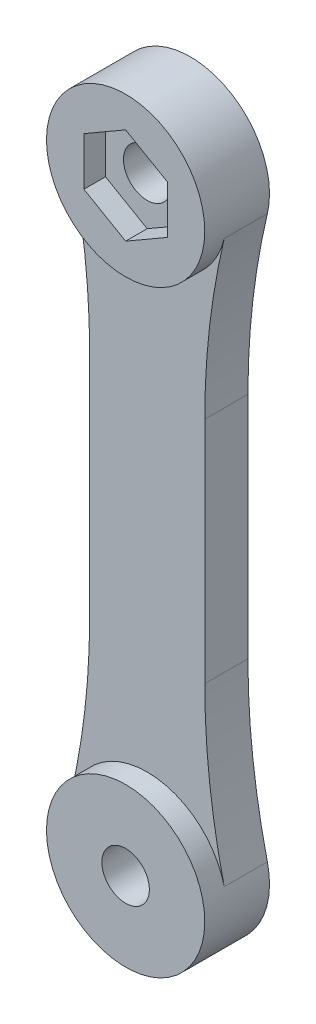
ISO-10303-21;
HEADER;
FILE_DESCRIPTION(('STEP AP214'),'2;1');
FILE_NAME('part.step','',(''),(''),'','','');
FILE_SCHEMA(('AUTOMOTIVE_DESIGN { 1 0 10303 214 1 1 1 1 }'));
ENDSEC;
DATA;
#1=APPLICATION_CONTEXT('core data for automotive mechanical design processes');
#2=APPLICATION_PROTOCOL_DEFINITION('international standard','automotive_design',2000,#1);
#3=PRODUCT_CONTEXT('',#1,'mechanical');
#4=PRODUCT('Part','Part','',(#3));
#5=PRODUCT_RELATED_PRODUCT_CATEGORY('part','',(#4));
#6=PRODUCT_DEFINITION_FORMATION('','',#4);
#7=PRODUCT_DEFINITION_CONTEXT('part definition',#1,'design');
#8=PRODUCT_DEFINITION('design','',#6,#7);
#9=PRODUCT_DEFINITION_SHAPE('','',#8);
#10=(LENGTH_UNIT() NAMED_UNIT(*) SI_UNIT(.MILLI.,.METRE.));
#11=(NAMED_UNIT(*) PLANE_ANGLE_UNIT() SI_UNIT($,.RADIAN.));
#12=(NAMED_UNIT(*) SI_UNIT($,.STERADIAN.) SOLID_ANGLE_UNIT());
#13=UNCERTAINTY_MEASURE_WITH_UNIT(LENGTH_MEASURE(1.E-05),#10,'distance_accuracy_value','');
#14=(GEOMETRIC_REPRESENTATION_CONTEXT(3) GLOBAL_UNCERTAINTY_ASSIGNED_CONTEXT((#13)) GLOBAL_UNIT_ASSIGNED_CONTEXT((#10,
#11,#12)) REPRESENTATION_CONTEXT('',''));
#15=CARTESIAN_POINT('',(0.,0.,0.));
#16=DIRECTION('',(0.,0.,1.));
#17=DIRECTION('',(1.,0.,0.));
#18=AXIS2_PLACEMENT_3D('',#15,#16,#17);
#19=CARTESIAN_POINT('',(1.82960326738668,-20.4654075970708,3.));
#20=DIRECTION('',(0.,0.,-1.));
#21=DIRECTION('',(-1.,0.,0.));
#22=AXIS2_PLACEMENT_3D('',#19,#20,#21);
#23=PLANE('',#22);
#24=CARTESIAN_POINT('',(1.82960326738667,21.0844268382,3.));
#25=DIRECTION('',(0.,0.,1.));
#26=DIRECTION('',(1.,0.,0.));
#27=AXIS2_PLACEMENT_3D('',#24,#25,#26);
#28=CIRCLE('',#27,5.5);
#29=CARTESIAN_POINT('',(-3.52174808396468,19.8143722274095,3.));
#30=VERTEX_POINT('',#29);
#31=CARTESIAN_POINT('',(7.18095461873802,19.8143722274095,3.));
#32=VERTEX_POINT('',#31);
#33=EDGE_CURVE('E57',#30,#32,#28,.T.);
#34=ORIENTED_EDGE('',*,*,#33,.F.);
#35=CARTESIAN_POINT('',(-52.1703967326133,8.26842122022369,3.));
#36=DIRECTION('',(0.,0.,-1.));
#37=DIRECTION('',(-1.,0.,0.));
#38=AXIS2_PLACEMENT_3D('',#35,#36,#37);
#39=CIRCLE('',#38,50.);
#40=CARTESIAN_POINT('',(-2.17039673261332,8.26842122022369,3.));
#41=VERTEX_POINT('',#40);
#42=EDGE_CURVE('E337',#30,#41,#39,.T.);
#43=ORIENTED_EDGE('',*,*,#42,.T.);
#44=DIRECTION('',(0.,-1.,0.));
#45=VECTOR('',#44,1.);
#46=CARTESIAN_POINT('',(-2.17039673261332,17.3095096205646,3.));
#47=LINE('',#46,#45);
#48=CARTESIAN_POINT('',(-2.17039673261332,-7.64940197909452,3.));
#49=VERTEX_POINT('',#48);
#50=EDGE_CURVE('E291',#41,#49,#47,.T.);
#51=ORIENTED_EDGE('',*,*,#50,.T.);
#52=CARTESIAN_POINT('',(-52.1703967326133,-7.64940197909452,3.));
#53=DIRECTION('',(0.,0.,-1.));
#54=DIRECTION('',(-1.,0.,0.));
#55=AXIS2_PLACEMENT_3D('',#52,#53,#54);
#56=CIRCLE('',#55,50.);
#57=CARTESIAN_POINT('',(-3.52174808396466,-19.1953529862804,3.));
#58=VERTEX_POINT('',#57);
#59=EDGE_CURVE('E328',#49,#58,#56,.T.);
#60=ORIENTED_EDGE('',*,*,#59,.T.);
#61=CARTESIAN_POINT('',(1.82960326738669,-20.4654075970708,3.));
#62=DIRECTION('',(0.,0.,1.));
#63=DIRECTION('',(1.,0.,0.));
#64=AXIS2_PLACEMENT_3D('',#61,#62,#63);
#65=CIRCLE('',#64,5.49999999999999);
#66=CARTESIAN_POINT('',(7.18095461873803,-19.1953529862803,3.));
#67=VERTEX_POINT('',#66);
#68=EDGE_CURVE('E276',#67,#58,#65,.T.);
#69=ORIENTED_EDGE('',*,*,#68,.F.);
#70=CARTESIAN_POINT('',(55.8296032673867,-7.64940197909448,3.));
#71=DIRECTION('',(0.,0.,-1.));
#72=DIRECTION('',(-1.,0.,0.));
#73=AXIS2_PLACEMENT_3D('',#70,#71,#72);
#74=CIRCLE('',#73,50.);
#75=CARTESIAN_POINT('',(5.82960326738668,-7.64940197909448,3.));
#76=VERTEX_POINT('',#75);
#77=EDGE_CURVE('E333',#67,#76,#74,.T.);
#78=ORIENTED_EDGE('',*,*,#77,.T.);
#79=DIRECTION('',(0.,1.,0.));
#80=VECTOR('',#79,1.);
#81=CARTESIAN_POINT('',(5.82960326738668,17.3095096205646,3.));
#82=LINE('',#81,#80);
#83=CARTESIAN_POINT('',(5.82960326738668,8.26842122022365,3.));
#84=VERTEX_POINT('',#83);
#85=EDGE_CURVE('E288',#76,#84,#82,.T.);
#86=ORIENTED_EDGE('',*,*,#85,.T.);
#87=CARTESIAN_POINT('',(55.8296032673867,8.26842122022365,3.));
#88=DIRECTION('',(0.,0.,-1.));
#89=DIRECTION('',(-1.,0.,0.));
#90=AXIS2_PLACEMENT_3D('',#87,#88,#89);
#91=CIRCLE('',#90,50.);
#92=EDGE_CURVE('E11',#84,#32,#91,.T.);
#93=ORIENTED_EDGE('',*,*,#92,.T.);
#94=EDGE_LOOP('',(#34,#43,#51,#60,#69,#78,#86,#93));
#95=FACE_BOUND('',#94,.T.);
#96=ADVANCED_FACE('F34',(#95),#23,.F.);
#97=DIRECTION('',(-0.86602540378444,0.499999999999997,0.));
#98=VECTOR('',#97,1.);
#99=CARTESIAN_POINT('',(1.82960326738667,24.4330583994998,3.));
#100=LINE('',#99,#98);
#101=CARTESIAN_POINT('',(4.72960326738667,22.7587426188499,3.));
#102=VERTEX_POINT('',#101);
#103=CARTESIAN_POINT('',(1.82960326738667,24.4330583994998,3.));
#104=VERTEX_POINT('',#103);
#105=EDGE_CURVE('E228',#102,#104,#100,.T.);
#106=ORIENTED_EDGE('',*,*,#105,.T.);
#107=DIRECTION('',(-0.866025403784437,-0.500000000000004,0.));
#108=VECTOR('',#107,1.);
#109=CARTESIAN_POINT('',(-1.07039673261333,22.7587426188499,3.));
#110=LINE('',#109,#108);
#111=CARTESIAN_POINT('',(-1.07039673261333,22.7587426188499,3.));
#112=VERTEX_POINT('',#111);
#113=EDGE_CURVE('E240',#104,#112,#110,.T.);
#114=ORIENTED_EDGE('',*,*,#113,.T.);
#115=DIRECTION('',(0.,-1.,0.));
#116=VECTOR('',#115,1.);
#117=CARTESIAN_POINT('',(-1.07039673261333,22.7587426188499,3.));
#118=LINE('',#117,#116);
#119=CARTESIAN_POINT('',(-1.07039673261333,19.41011105755,3.));
#120=VERTEX_POINT('',#119);
#121=EDGE_CURVE('E243',#112,#120,#118,.T.);
#122=ORIENTED_EDGE('',*,*,#121,.T.);
#123=DIRECTION('',(0.86602540378444,-0.499999999999997,0.));
#124=VECTOR('',#123,1.);
#125=CARTESIAN_POINT('',(-1.07039673261333,19.41011105755,3.));
#126=LINE('',#125,#124);
#127=CARTESIAN_POINT('',(1.82960326738668,17.7357952769001,3.));
#128=VERTEX_POINT('',#127);
#129=EDGE_CURVE('E246',#120,#128,#126,.T.);
#130=ORIENTED_EDGE('',*,*,#129,.T.);
#131=DIRECTION('',(0.866025403784437,0.500000000000003,0.));
#132=VECTOR('',#131,1.);
#133=CARTESIAN_POINT('',(1.82960326738668,17.7357952769001,3.));
#134=LINE('',#133,#132);
#135=CARTESIAN_POINT('',(4.72960326738667,19.4101110575501,3.));
#136=VERTEX_POINT('',#135);
#137=EDGE_CURVE('E249',#128,#136,#134,.T.);
#138=ORIENTED_EDGE('',*,*,#137,.T.);
#139=DIRECTION('',(0.,1.,0.));
#140=VECTOR('',#139,1.);
#141=CARTESIAN_POINT('',(4.72960326738667,22.7587426188499,3.));
#142=LINE('',#141,#140);
#143=EDGE_CURVE('E252',#136,#102,#142,.T.);
#144=ORIENTED_EDGE('',*,*,#143,.T.);
#145=EDGE_LOOP('',(#106,#114,#122,#130,#138,#144));
#146=FACE_BOUND('',#145,.T.);
#147=CARTESIAN_POINT('',(1.82960326738668,21.0844268382,3.));
#148=DIRECTION('',(0.,0.,1.));
#149=DIRECTION('',(1.,0.,0.));
#150=AXIS2_PLACEMENT_3D('',#147,#148,#149);
#151=CIRCLE('',#150,1.65);
#152=CARTESIAN_POINT('',(3.47960326738668,21.0844268382,3.));
#153=VERTEX_POINT('',#152);
#154=EDGE_CURVE('E282',#153,#153,#151,.T.);
#155=ORIENTED_EDGE('',*,*,#154,.F.);
#156=EDGE_LOOP('',(#155));
#157=FACE_BOUND('',#156,.T.);
#158=ADVANCED_FACE('F401',(#146,#157),#23,.F.);
#159=CARTESIAN_POINT('',(1.82960326738668,-20.4654075970708,0.));
#160=DIRECTION('',(0.,0.,-1.));
#161=DIRECTION('',(-1.,0.,0.));
#162=AXIS2_PLACEMENT_3D('',#159,#160,#161);
#163=PLANE('',#162);
#164=DIRECTION('',(0.866025403784436,-0.500000000000005,0.));
#165=VECTOR('',#164,1.);
#166=CARTESIAN_POINT('',(4.72960326738668,-18.7910918164209,0.));
#167=LINE('',#166,#165);
#168=CARTESIAN_POINT('',(1.82960326738669,-17.116776035771,0.));
#169=VERTEX_POINT('',#168);
#170=CARTESIAN_POINT('',(4.72960326738668,-18.7910918164209,0.));
#171=VERTEX_POINT('',#170);
#172=EDGE_CURVE('E50',#169,#171,#167,.T.);
#173=ORIENTED_EDGE('',*,*,#172,.F.);
#174=DIRECTION('',(0.866025403784442,0.499999999999995,0.));
#175=VECTOR('',#174,1.);
#176=CARTESIAN_POINT('',(1.82960326738669,-17.116776035771,0.));
#177=LINE('',#176,#175);
#178=CARTESIAN_POINT('',(-1.07039673261332,-18.7910918164209,0.));
#179=VERTEX_POINT('',#178);
#180=EDGE_CURVE('E192',#179,#169,#177,.T.);
#181=ORIENTED_EDGE('',*,*,#180,.F.);
#182=DIRECTION('',(0.,1.,0.));
#183=VECTOR('',#182,1.);
#184=CARTESIAN_POINT('',(-1.07039673261332,-18.7910918164209,0.));
#185=LINE('',#184,#183);
#186=CARTESIAN_POINT('',(-1.07039673261332,-22.1397233777207,0.));
#187=VERTEX_POINT('',#186);
#188=EDGE_CURVE('E195',#187,#179,#185,.T.);
#189=ORIENTED_EDGE('',*,*,#188,.F.);
#190=DIRECTION('',(-0.866025403784436,0.500000000000005,0.));
#191=VECTOR('',#190,1.);
#192=CARTESIAN_POINT('',(1.82960326738667,-23.8140391583706,0.));
#193=LINE('',#192,#191);
#194=CARTESIAN_POINT('',(1.82960326738667,-23.8140391583706,0.));
#195=VERTEX_POINT('',#194);
#196=EDGE_CURVE('E211',#195,#187,#193,.T.);
#197=ORIENTED_EDGE('',*,*,#196,.F.);
#198=DIRECTION('',(-0.866025403784441,-0.499999999999996,0.));
#199=VECTOR('',#198,1.);
#200=CARTESIAN_POINT('',(4.72960326738668,-22.1397233777207,0.));
#201=LINE('',#200,#199);
#202=CARTESIAN_POINT('',(4.72960326738668,-22.1397233777207,0.));
#203=VERTEX_POINT('',#202);
#204=EDGE_CURVE('E208',#203,#195,#201,.T.);
#205=ORIENTED_EDGE('',*,*,#204,.F.);
#206=DIRECTION('',(0.,-1.,0.));
#207=VECTOR('',#206,1.);
#208=CARTESIAN_POINT('',(4.72960326738668,-18.7910918164209,0.));
#209=LINE('',#208,#207);
#210=EDGE_CURVE('E206',#171,#203,#209,.T.);
#211=ORIENTED_EDGE('',*,*,#210,.F.);
#212=EDGE_LOOP('',(#173,#181,#189,#197,#205,#211));
#213=FACE_BOUND('',#212,.T.);
#214=CARTESIAN_POINT('',(1.82960326738668,21.0844268382,0.));
#215=DIRECTION('',(0.,0.,1.));
#216=DIRECTION('',(1.,0.,0.));
#217=AXIS2_PLACEMENT_3D('',#214,#215,#216);
#218=CIRCLE('',#217,1.65);
#219=CARTESIAN_POINT('',(3.47960326738668,21.0844268382,0.));
#220=VERTEX_POINT('',#219);
#221=EDGE_CURVE('E280',#220,#220,#218,.T.);
#222=ORIENTED_EDGE('',*,*,#221,.T.);
#223=EDGE_LOOP('',(#222));
#224=FACE_BOUND('',#223,.T.);
#225=CARTESIAN_POINT('',(1.82960326738668,-20.4654075970708,0.));
#226=DIRECTION('',(0.,0.,1.));
#227=DIRECTION('',(-1.,0.,0.));
#228=AXIS2_PLACEMENT_3D('',#225,#226,#227);
#229=CIRCLE('',#228,5.5);
#230=CARTESIAN_POINT('',(-3.52174808396467,-19.1953529862804,0.));
#231=VERTEX_POINT('',#230);
#232=CARTESIAN_POINT('',(7.18095461873803,-19.1953529862803,0.));
#233=VERTEX_POINT('',#232);
#234=EDGE_CURVE('E285',#231,#233,#229,.T.);
#235=ORIENTED_EDGE('',*,*,#234,.F.);
#236=CARTESIAN_POINT('',(-52.1703967326133,-7.64940197909452,0.));
#237=DIRECTION('',(0.,0.,-1.));
#238=DIRECTION('',(-1.,0.,0.));
#239=AXIS2_PLACEMENT_3D('',#236,#237,#238);
#240=CIRCLE('',#239,50.);
#241=CARTESIAN_POINT('',(-2.17039673261332,-7.64940197909452,0.));
#242=VERTEX_POINT('',#241);
#243=EDGE_CURVE('E326',#231,#242,#240,.F.);
#244=ORIENTED_EDGE('',*,*,#243,.T.);
#245=DIRECTION('',(0.,-1.,0.));
#246=VECTOR('',#245,1.);
#247=CARTESIAN_POINT('',(-2.17039673261332,17.3095096205646,0.));
#248=LINE('',#247,#246);
#249=CARTESIAN_POINT('',(-2.17039673261332,8.26842122022369,0.));
#250=VERTEX_POINT('',#249);
#251=EDGE_CURVE('E292',#250,#242,#248,.T.);
#252=ORIENTED_EDGE('',*,*,#251,.F.);
#253=CARTESIAN_POINT('',(-52.1703967326133,8.26842122022369,0.));
#254=DIRECTION('',(0.,0.,-1.));
#255=DIRECTION('',(-1.,0.,0.));
#256=AXIS2_PLACEMENT_3D('',#253,#254,#255);
#257=CIRCLE('',#256,50.);
#258=CARTESIAN_POINT('',(-3.52174808396467,19.8143722274095,0.));
#259=VERTEX_POINT('',#258);
#260=EDGE_CURVE('E335',#250,#259,#257,.F.);
#261=ORIENTED_EDGE('',*,*,#260,.T.);
#262=CARTESIAN_POINT('',(1.82960326738668,21.0844268382,0.));
#263=DIRECTION('',(0.,0.,1.));
#264=DIRECTION('',(1.,0.,0.));
#265=AXIS2_PLACEMENT_3D('',#262,#263,#264);
#266=CIRCLE('',#265,5.5);
#267=CARTESIAN_POINT('',(7.18095461873803,19.8143722274095,0.));
#268=VERTEX_POINT('',#267);
#269=EDGE_CURVE('E301',#268,#259,#266,.T.);
#270=ORIENTED_EDGE('',*,*,#269,.F.);
#271=CARTESIAN_POINT('',(55.8296032673867,8.26842122022365,0.));
#272=DIRECTION('',(0.,0.,-1.));
#273=DIRECTION('',(-1.,0.,0.));
#274=AXIS2_PLACEMENT_3D('',#271,#272,#273);
#275=CIRCLE('',#274,50.);
#276=CARTESIAN_POINT('',(5.82960326738668,8.26842122022365,0.));
#277=VERTEX_POINT('',#276);
#278=EDGE_CURVE('E43',#268,#277,#275,.F.);
#279=ORIENTED_EDGE('',*,*,#278,.T.);
#280=DIRECTION('',(0.,1.,0.));
#281=VECTOR('',#280,1.);
#282=CARTESIAN_POINT('',(5.82960326738668,17.3095096205646,0.));
#283=LINE('',#282,#281);
#284=CARTESIAN_POINT('',(5.82960326738668,-7.64940197909448,0.));
#285=VERTEX_POINT('',#284);
#286=EDGE_CURVE('E298',#285,#277,#283,.T.);
#287=ORIENTED_EDGE('',*,*,#286,.F.);
#288=CARTESIAN_POINT('',(55.8296032673867,-7.64940197909448,0.));
#289=DIRECTION('',(0.,0.,-1.));
#290=DIRECTION('',(-1.,0.,0.));
#291=AXIS2_PLACEMENT_3D('',#288,#289,#290);
#292=CIRCLE('',#291,50.);
#293=EDGE_CURVE('E331',#285,#233,#292,.F.);
#294=ORIENTED_EDGE('',*,*,#293,.T.);
#295=EDGE_LOOP('',(#235,#244,#252,#261,#270,#279,#287,#294));
#296=FACE_BOUND('',#295,.T.);
#297=ADVANCED_FACE('F343',(#213,#224,#296),#163,.T.);
#298=CARTESIAN_POINT('',(1.82960326738668,-20.4654075970708,3.));
#299=DIRECTION('',(0.,0.,-1.));
#300=DIRECTION('',(-1.,0.,0.));
#301=AXIS2_PLACEMENT_3D('',#298,#299,#300);
#302=CYLINDRICAL_SURFACE('',#301,5.5);
#303=ORIENTED_EDGE('',*,*,#68,.T.);
#304=DIRECTION('',(0.,0.,-1.));
#305=VECTOR('',#304,1.);
#306=CARTESIAN_POINT('',(-3.52174808396467,-19.1953529862804,3.));
#307=LINE('',#306,#305);
#308=EDGE_CURVE('E308',#58,#231,#307,.T.);
#309=ORIENTED_EDGE('',*,*,#308,.T.);
#310=ORIENTED_EDGE('',*,*,#234,.T.);
#311=DIRECTION('',(0.,0.,-1.));
#312=VECTOR('',#311,1.);
#313=CARTESIAN_POINT('',(7.18095461873803,-19.1953529862803,3.));
#314=LINE('',#313,#312);
#315=EDGE_CURVE('E295',#233,#67,#314,.F.);
#316=ORIENTED_EDGE('',*,*,#315,.T.);
#317=EDGE_LOOP('',(#303,#309,#310,#316));
#318=FACE_BOUND('',#317,.T.);
#319=CARTESIAN_POINT('',(1.82960326738669,-20.4654075970708,4.5));
#320=DIRECTION('',(0.,0.,1.));
#321=DIRECTION('',(1.,0.,0.));
#322=AXIS2_PLACEMENT_3D('',#319,#320,#321);
#323=CIRCLE('',#322,5.49999999999999);
#324=CARTESIAN_POINT('',(7.32960326738668,-20.4654075970708,4.5));
#325=VERTEX_POINT('',#324);
#326=EDGE_CURVE('E277',#325,#325,#323,.T.);
#327=ORIENTED_EDGE('',*,*,#326,.F.);
#328=EDGE_LOOP('',(#327));
#329=FACE_BOUND('',#328,.T.);
#330=ADVANCED_FACE('F357',(#318,#329),#302,.T.);
#331=CARTESIAN_POINT('',(5.82960326738668,17.3095096205646,3.));
#332=DIRECTION('',(-1.,0.,0.));
#333=DIRECTION('',(0.,0.,1.));
#334=AXIS2_PLACEMENT_3D('',#331,#332,#333);
#335=PLANE('',#334);
#336=ORIENTED_EDGE('',*,*,#85,.F.);
#337=DIRECTION('',(0.,0.,1.));
#338=VECTOR('',#337,1.);
#339=CARTESIAN_POINT('',(5.82960326738668,-7.64940197909448,0.));
#340=LINE('',#339,#338);
#341=EDGE_CURVE('E318',#76,#285,#340,.F.);
#342=ORIENTED_EDGE('',*,*,#341,.T.);
#343=ORIENTED_EDGE('',*,*,#286,.T.);
#344=DIRECTION('',(0.,0.,1.));
#345=VECTOR('',#344,1.);
#346=CARTESIAN_POINT('',(5.82960326738668,8.26842122022365,3.));
#347=LINE('',#346,#345);
#348=EDGE_CURVE('E316',#277,#84,#347,.T.);
#349=ORIENTED_EDGE('',*,*,#348,.T.);
#350=EDGE_LOOP('',(#336,#342,#343,#349));
#351=FACE_BOUND('',#350,.T.);
#352=ADVANCED_FACE('F349',(#351),#335,.F.);
#353=CARTESIAN_POINT('',(1.82960326738668,21.0844268382,3.));
#354=DIRECTION('',(0.,0.,-1.));
#355=DIRECTION('',(-1.,0.,0.));
#356=AXIS2_PLACEMENT_3D('',#353,#354,#355);
#357=CYLINDRICAL_SURFACE('',#356,5.5);
#358=ORIENTED_EDGE('',*,*,#269,.T.);
#359=DIRECTION('',(0.,0.,-1.));
#360=VECTOR('',#359,1.);
#361=CARTESIAN_POINT('',(-3.52174808396467,19.8143722274095,3.));
#362=LINE('',#361,#360);
#363=EDGE_CURVE('E324',#259,#30,#362,.F.);
#364=ORIENTED_EDGE('',*,*,#363,.T.);
#365=ORIENTED_EDGE('',*,*,#33,.T.);
#366=DIRECTION('',(0.,0.,-1.));
#367=VECTOR('',#366,1.);
#368=CARTESIAN_POINT('',(7.18095461873803,19.8143722274095,3.));
#369=LINE('',#368,#367);
#370=EDGE_CURVE('E321',#32,#268,#369,.T.);
#371=ORIENTED_EDGE('',*,*,#370,.T.);
#372=EDGE_LOOP('',(#358,#364,#365,#371));
#373=FACE_BOUND('',#372,.T.);
#374=CARTESIAN_POINT('',(1.82960326738667,21.0844268382,4.5));
#375=DIRECTION('',(0.,0.,1.));
#376=DIRECTION('',(1.,0.,0.));
#377=AXIS2_PLACEMENT_3D('',#374,#375,#376);
#378=CIRCLE('',#377,5.5);
#379=CARTESIAN_POINT('',(7.32960326738667,21.0844268382,4.5));
#380=VERTEX_POINT('',#379);
#381=EDGE_CURVE('E269',#380,#380,#378,.T.);
#382=ORIENTED_EDGE('',*,*,#381,.F.);
#383=EDGE_LOOP('',(#382));
#384=FACE_BOUND('',#383,.T.);
#385=ADVANCED_FACE('F374',(#373,#384),#357,.T.);
#386=CARTESIAN_POINT('',(-2.17039673261332,17.3095096205646,3.));
#387=DIRECTION('',(1.,0.,0.));
#388=DIRECTION('',(0.,0.,-1.));
#389=AXIS2_PLACEMENT_3D('',#386,#387,#388);
#390=PLANE('',#389);
#391=ORIENTED_EDGE('',*,*,#251,.T.);
#392=DIRECTION('',(0.,0.,1.));
#393=VECTOR('',#392,1.);
#394=CARTESIAN_POINT('',(-2.17039673261332,-7.64940197909452,3.));
#395=LINE('',#394,#393);
#396=EDGE_CURVE('E314',#242,#49,#395,.T.);
#397=ORIENTED_EDGE('',*,*,#396,.T.);
#398=ORIENTED_EDGE('',*,*,#50,.F.);
#399=DIRECTION('',(0.,0.,1.));
#400=VECTOR('',#399,1.);
#401=CARTESIAN_POINT('',(-2.17039673261332,8.26842122022369,0.));
#402=LINE('',#401,#400);
#403=EDGE_CURVE('E311',#41,#250,#402,.F.);
#404=ORIENTED_EDGE('',*,*,#403,.T.);
#405=EDGE_LOOP('',(#391,#397,#398,#404));
#406=FACE_BOUND('',#405,.T.);
#407=ADVANCED_FACE('F366',(#406),#390,.F.);
#408=CARTESIAN_POINT('',(1.82960326738668,21.0844268382,3.));
#409=DIRECTION('',(0.,0.,-1.));
#410=DIRECTION('',(-1.,0.,0.));
#411=AXIS2_PLACEMENT_3D('',#408,#409,#410);
#412=CYLINDRICAL_SURFACE('',#411,1.65);
#413=ORIENTED_EDGE('',*,*,#154,.T.);
#414=EDGE_LOOP('',(#413));
#415=FACE_BOUND('',#414,.T.);
#416=ORIENTED_EDGE('',*,*,#221,.F.);
#417=EDGE_LOOP('',(#416));
#418=FACE_BOUND('',#417,.T.);
#419=ADVANCED_FACE('F431',(#415,#418),#412,.F.);
#420=CARTESIAN_POINT('',(1.82960326738668,-20.4654075970708,3.));
#421=DIRECTION('',(0.,0.,-1.));
#422=DIRECTION('',(-1.,0.,0.));
#423=AXIS2_PLACEMENT_3D('',#420,#421,#422);
#424=CYLINDRICAL_SURFACE('',#423,1.65);
#425=CARTESIAN_POINT('',(1.82960326738668,-20.4654075970708,1.5));
#426=DIRECTION('',(0.,0.,1.));
#427=DIRECTION('',(1.,0.,0.));
#428=AXIS2_PLACEMENT_3D('',#425,#426,#427);
#429=CIRCLE('',#428,1.65);
#430=CARTESIAN_POINT('',(3.47960326738668,-20.4654075970708,1.5));
#431=VERTEX_POINT('',#430);
#432=EDGE_CURVE('E38',#431,#431,#429,.T.);
#433=ORIENTED_EDGE('',*,*,#432,.F.);
#434=EDGE_LOOP('',(#433));
#435=FACE_BOUND('',#434,.T.);
#436=CARTESIAN_POINT('',(1.82960326738669,-20.4654075970708,4.5));
#437=DIRECTION('',(0.,0.,1.));
#438=DIRECTION('',(1.,0.,0.));
#439=AXIS2_PLACEMENT_3D('',#436,#437,#438);
#440=CIRCLE('',#439,1.65);
#441=CARTESIAN_POINT('',(3.47960326738669,-20.4654075970708,4.5));
#442=VERTEX_POINT('',#441);
#443=EDGE_CURVE('E272',#442,#442,#440,.T.);
#444=ORIENTED_EDGE('',*,*,#443,.T.);
#445=EDGE_LOOP('',(#444));
#446=FACE_BOUND('',#445,.T.);
#447=ADVANCED_FACE('F498',(#435,#446),#424,.F.);
#448=CARTESIAN_POINT('',(1.82960326738669,-20.4654075970708,4.5));
#449=DIRECTION('',(0.,0.,1.));
#450=DIRECTION('',(1.,0.,0.));
#451=AXIS2_PLACEMENT_3D('',#448,#449,#450);
#452=PLANE('',#451);
#453=ORIENTED_EDGE('',*,*,#326,.T.);
#454=EDGE_LOOP('',(#453));
#455=FACE_BOUND('',#454,.T.);
#456=ORIENTED_EDGE('',*,*,#443,.F.);
#457=EDGE_LOOP('',(#456));
#458=FACE_BOUND('',#457,.T.);
#459=ADVANCED_FACE('F384',(#455,#458),#452,.T.);
#460=CARTESIAN_POINT('',(1.82960326738667,21.0844268382,4.5));
#461=DIRECTION('',(0.,0.,1.));
#462=DIRECTION('',(1.,0.,0.));
#463=AXIS2_PLACEMENT_3D('',#460,#461,#462);
#464=PLANE('',#463);
#465=ORIENTED_EDGE('',*,*,#381,.T.);
#466=EDGE_LOOP('',(#465));
#467=FACE_BOUND('',#466,.T.);
#468=DIRECTION('',(0.,-1.,0.));
#469=VECTOR('',#468,1.);
#470=CARTESIAN_POINT('',(-1.07039673261333,22.7587426188499,4.5));
#471=LINE('',#470,#469);
#472=CARTESIAN_POINT('',(-1.07039673261333,22.7587426188499,4.5));
#473=VERTEX_POINT('',#472);
#474=CARTESIAN_POINT('',(-1.07039673261333,19.41011105755,4.5));
#475=VERTEX_POINT('',#474);
#476=EDGE_CURVE('E227',#473,#475,#471,.T.);
#477=ORIENTED_EDGE('',*,*,#476,.F.);
#478=DIRECTION('',(-0.866025403784437,-0.500000000000004,0.));
#479=VECTOR('',#478,1.);
#480=CARTESIAN_POINT('',(-1.07039673261333,22.7587426188499,4.5));
#481=LINE('',#480,#479);
#482=CARTESIAN_POINT('',(1.82960326738667,24.4330583994998,4.5));
#483=VERTEX_POINT('',#482);
#484=EDGE_CURVE('E225',#483,#473,#481,.T.);
#485=ORIENTED_EDGE('',*,*,#484,.F.);
#486=DIRECTION('',(-0.86602540378444,0.499999999999997,0.));
#487=VECTOR('',#486,1.);
#488=CARTESIAN_POINT('',(1.82960326738667,24.4330583994998,4.5));
#489=LINE('',#488,#487);
#490=CARTESIAN_POINT('',(4.72960326738667,22.7587426188499,4.5));
#491=VERTEX_POINT('',#490);
#492=EDGE_CURVE('E237',#491,#483,#489,.T.);
#493=ORIENTED_EDGE('',*,*,#492,.F.);
#494=DIRECTION('',(0.,1.,0.));
#495=VECTOR('',#494,1.);
#496=CARTESIAN_POINT('',(4.72960326738667,22.7587426188499,4.5));
#497=LINE('',#496,#495);
#498=CARTESIAN_POINT('',(4.72960326738667,19.4101110575501,4.5));
#499=VERTEX_POINT('',#498);
#500=EDGE_CURVE('E234',#499,#491,#497,.T.);
#501=ORIENTED_EDGE('',*,*,#500,.F.);
#502=DIRECTION('',(0.866025403784437,0.500000000000003,0.));
#503=VECTOR('',#502,1.);
#504=CARTESIAN_POINT('',(1.82960326738668,17.7357952769001,4.5));
#505=LINE('',#504,#503);
#506=CARTESIAN_POINT('',(1.82960326738668,17.7357952769001,4.5));
#507=VERTEX_POINT('',#506);
#508=EDGE_CURVE('E232',#507,#499,#505,.T.);
#509=ORIENTED_EDGE('',*,*,#508,.F.);
#510=DIRECTION('',(0.86602540378444,-0.499999999999997,0.));
#511=VECTOR('',#510,1.);
#512=CARTESIAN_POINT('',(-1.07039673261333,19.41011105755,4.5));
#513=LINE('',#512,#511);
#514=EDGE_CURVE('E230',#475,#507,#513,.T.);
#515=ORIENTED_EDGE('',*,*,#514,.F.);
#516=EDGE_LOOP('',(#477,#485,#493,#501,#509,#515));
#517=FACE_BOUND('',#516,.T.);
#518=ADVANCED_FACE('F380',(#467,#517),#464,.T.);
#519=CARTESIAN_POINT('',(-1.07039673261333,22.7587426188499,4.5));
#520=DIRECTION('',(0.500000000000004,-0.866025403784436,0.));
#521=DIRECTION('',(0.866025403784437,0.500000000000004,0.));
#522=AXIS2_PLACEMENT_3D('',#519,#520,#521);
#523=PLANE('',#522);
#524=ORIENTED_EDGE('',*,*,#113,.F.);
#525=DIRECTION('',(0.,0.,-1.));
#526=VECTOR('',#525,1.);
#527=CARTESIAN_POINT('',(1.82960326738667,24.4330583994998,4.5));
#528=LINE('',#527,#526);
#529=EDGE_CURVE('E239',#483,#104,#528,.T.);
#530=ORIENTED_EDGE('',*,*,#529,.F.);
#531=ORIENTED_EDGE('',*,*,#484,.T.);
#532=DIRECTION('',(0.,0.,-1.));
#533=VECTOR('',#532,1.);
#534=CARTESIAN_POINT('',(-1.07039673261333,22.7587426188499,4.5));
#535=LINE('',#534,#533);
#536=EDGE_CURVE('E266',#473,#112,#535,.T.);
#537=ORIENTED_EDGE('',*,*,#536,.T.);
#538=EDGE_LOOP('',(#524,#530,#531,#537));
#539=FACE_BOUND('',#538,.T.);
#540=ADVANCED_FACE('F383',(#539),#523,.T.);
#541=CARTESIAN_POINT('',(-1.07039673261333,22.7587426188499,4.5));
#542=DIRECTION('',(1.,0.,0.));
#543=DIRECTION('',(0.,1.,0.));
#544=AXIS2_PLACEMENT_3D('',#541,#542,#543);
#545=PLANE('',#544);
#546=ORIENTED_EDGE('',*,*,#121,.F.);
#547=ORIENTED_EDGE('',*,*,#536,.F.);
#548=ORIENTED_EDGE('',*,*,#476,.T.);
#549=DIRECTION('',(0.,0.,-1.));
#550=VECTOR('',#549,1.);
#551=CARTESIAN_POINT('',(-1.07039673261333,19.41011105755,4.5));
#552=LINE('',#551,#550);
#553=EDGE_CURVE('E264',#475,#120,#552,.T.);
#554=ORIENTED_EDGE('',*,*,#553,.T.);
#555=EDGE_LOOP('',(#546,#547,#548,#554));
#556=FACE_BOUND('',#555,.T.);
#557=ADVANCED_FACE('F394',(#556),#545,.T.);
#558=CARTESIAN_POINT('',(-1.07039673261333,19.41011105755,4.5));
#559=DIRECTION('',(0.499999999999997,0.86602540378444,0.));
#560=DIRECTION('',(-0.86602540378444,0.499999999999997,0.));
#561=AXIS2_PLACEMENT_3D('',#558,#559,#560);
#562=PLANE('',#561);
#563=ORIENTED_EDGE('',*,*,#129,.F.);
#564=ORIENTED_EDGE('',*,*,#553,.F.);
#565=ORIENTED_EDGE('',*,*,#514,.T.);
#566=DIRECTION('',(0.,0.,-1.));
#567=VECTOR('',#566,1.);
#568=CARTESIAN_POINT('',(1.82960326738668,17.7357952769001,4.5));
#569=LINE('',#568,#567);
#570=EDGE_CURVE('E262',#507,#128,#569,.T.);
#571=ORIENTED_EDGE('',*,*,#570,.T.);
#572=EDGE_LOOP('',(#563,#564,#565,#571));
#573=FACE_BOUND('',#572,.T.);
#574=ADVANCED_FACE('F397',(#573),#562,.T.);
#575=CARTESIAN_POINT('',(1.82960326738668,17.7357952769001,4.5));
#576=DIRECTION('',(-0.500000000000002,0.866025403784437,0.));
#577=DIRECTION('',(-0.866025403784437,-0.500000000000003,0.));
#578=AXIS2_PLACEMENT_3D('',#575,#576,#577);
#579=PLANE('',#578);
#580=ORIENTED_EDGE('',*,*,#137,.F.);
#581=ORIENTED_EDGE('',*,*,#570,.F.);
#582=ORIENTED_EDGE('',*,*,#508,.T.);
#583=DIRECTION('',(0.,0.,-1.));
#584=VECTOR('',#583,1.);
#585=CARTESIAN_POINT('',(4.72960326738667,19.4101110575501,4.5));
#586=LINE('',#585,#584);
#587=EDGE_CURVE('E260',#499,#136,#586,.T.);
#588=ORIENTED_EDGE('',*,*,#587,.T.);
#589=EDGE_LOOP('',(#580,#581,#582,#588));
#590=FACE_BOUND('',#589,.T.);
#591=ADVANCED_FACE('F415',(#590),#579,.T.);
#592=CARTESIAN_POINT('',(4.72960326738667,22.7587426188499,4.5));
#593=DIRECTION('',(-1.,0.,0.));
#594=DIRECTION('',(0.,-1.,0.));
#595=AXIS2_PLACEMENT_3D('',#592,#593,#594);
#596=PLANE('',#595);
#597=ORIENTED_EDGE('',*,*,#143,.F.);
#598=ORIENTED_EDGE('',*,*,#587,.F.);
#599=ORIENTED_EDGE('',*,*,#500,.T.);
#600=DIRECTION('',(0.,0.,-1.));
#601=VECTOR('',#600,1.);
#602=CARTESIAN_POINT('',(4.72960326738667,22.7587426188499,4.5));
#603=LINE('',#602,#601);
#604=EDGE_CURVE('E258',#491,#102,#603,.T.);
#605=ORIENTED_EDGE('',*,*,#604,.T.);
#606=EDGE_LOOP('',(#597,#598,#599,#605));
#607=FACE_BOUND('',#606,.T.);
#608=ADVANCED_FACE('F413',(#607),#596,.T.);
#609=CARTESIAN_POINT('',(1.82960326738667,24.4330583994998,4.5));
#610=DIRECTION('',(-0.499999999999997,-0.866025403784441,0.));
#611=DIRECTION('',(0.866025403784441,-0.499999999999997,0.));
#612=AXIS2_PLACEMENT_3D('',#609,#610,#611);
#613=PLANE('',#612);
#614=ORIENTED_EDGE('',*,*,#105,.F.);
#615=ORIENTED_EDGE('',*,*,#604,.F.);
#616=ORIENTED_EDGE('',*,*,#492,.T.);
#617=ORIENTED_EDGE('',*,*,#529,.T.);
#618=EDGE_LOOP('',(#614,#615,#616,#617));
#619=FACE_BOUND('',#618,.T.);
#620=ADVANCED_FACE('F408',(#619),#613,.T.);
#621=CARTESIAN_POINT('',(-52.1703967326133,-7.64940197909452,3.));
#622=DIRECTION('',(0.,0.,-1.));
#623=DIRECTION('',(-1.,0.,0.));
#624=AXIS2_PLACEMENT_3D('',#621,#622,#623);
#625=CYLINDRICAL_SURFACE('',#624,50.);
#626=ORIENTED_EDGE('',*,*,#59,.F.);
#627=ORIENTED_EDGE('',*,*,#396,.F.);
#628=ORIENTED_EDGE('',*,*,#243,.F.);
#629=ORIENTED_EDGE('',*,*,#308,.F.);
#630=EDGE_LOOP('',(#626,#627,#628,#629));
#631=FACE_BOUND('',#630,.T.);
#632=ADVANCED_FACE('F362',(#631),#625,.F.);
#633=CARTESIAN_POINT('',(55.8296032673867,-7.64940197909448,3.));
#634=DIRECTION('',(0.,0.,-1.));
#635=DIRECTION('',(-1.,0.,0.));
#636=AXIS2_PLACEMENT_3D('',#633,#634,#635);
#637=CYLINDRICAL_SURFACE('',#636,50.);
#638=ORIENTED_EDGE('',*,*,#77,.F.);
#639=ORIENTED_EDGE('',*,*,#315,.F.);
#640=ORIENTED_EDGE('',*,*,#293,.F.);
#641=ORIENTED_EDGE('',*,*,#341,.F.);
#642=EDGE_LOOP('',(#638,#639,#640,#641));
#643=FACE_BOUND('',#642,.T.);
#644=ADVANCED_FACE('F354',(#643),#637,.F.);
#645=CARTESIAN_POINT('',(-52.1703967326133,8.26842122022369,3.));
#646=DIRECTION('',(0.,0.,-1.));
#647=DIRECTION('',(-1.,0.,0.));
#648=AXIS2_PLACEMENT_3D('',#645,#646,#647);
#649=CYLINDRICAL_SURFACE('',#648,50.);
#650=ORIENTED_EDGE('',*,*,#42,.F.);
#651=ORIENTED_EDGE('',*,*,#363,.F.);
#652=ORIENTED_EDGE('',*,*,#260,.F.);
#653=ORIENTED_EDGE('',*,*,#403,.F.);
#654=EDGE_LOOP('',(#650,#651,#652,#653));
#655=FACE_BOUND('',#654,.T.);
#656=ADVANCED_FACE('F371',(#655),#649,.F.);
#657=CARTESIAN_POINT('',(55.8296032673867,8.26842122022365,3.));
#658=DIRECTION('',(0.,0.,-1.));
#659=DIRECTION('',(-1.,0.,0.));
#660=AXIS2_PLACEMENT_3D('',#657,#658,#659);
#661=CYLINDRICAL_SURFACE('',#660,50.);
#662=ORIENTED_EDGE('',*,*,#92,.F.);
#663=ORIENTED_EDGE('',*,*,#348,.F.);
#664=ORIENTED_EDGE('',*,*,#278,.F.);
#665=ORIENTED_EDGE('',*,*,#370,.F.);
#666=EDGE_LOOP('',(#662,#663,#664,#665));
#667=FACE_BOUND('',#666,.T.);
#668=ADVANCED_FACE('F36',(#667),#661,.F.);
#669=CARTESIAN_POINT('',(4.72960326738668,-18.7910918164209,1.5));
#670=DIRECTION('',(0.500000000000005,0.866025403784436,0.));
#671=DIRECTION('',(-0.866025403784436,0.500000000000005,0.));
#672=AXIS2_PLACEMENT_3D('',#669,#670,#671);
#673=PLANE('',#672);
#674=ORIENTED_EDGE('',*,*,#172,.T.);
#675=DIRECTION('',(0.,0.,-1.));
#676=VECTOR('',#675,1.);
#677=CARTESIAN_POINT('',(4.72960326738668,-18.7910918164209,1.5));
#678=LINE('',#677,#676);
#679=CARTESIAN_POINT('',(4.72960326738668,-18.7910918164209,1.5));
#680=VERTEX_POINT('',#679);
#681=EDGE_CURVE('E169',#680,#171,#678,.T.);
#682=ORIENTED_EDGE('',*,*,#681,.F.);
#683=DIRECTION('',(0.866025403784436,-0.500000000000005,0.));
#684=VECTOR('',#683,1.);
#685=CARTESIAN_POINT('',(4.72960326738668,-18.7910918164209,1.5));
#686=LINE('',#685,#684);
#687=CARTESIAN_POINT('',(1.82960326738669,-17.116776035771,1.5));
#688=VERTEX_POINT('',#687);
#689=EDGE_CURVE('E173',#688,#680,#686,.T.);
#690=ORIENTED_EDGE('',*,*,#689,.F.);
#691=DIRECTION('',(0.,0.,-1.));
#692=VECTOR('',#691,1.);
#693=CARTESIAN_POINT('',(1.82960326738669,-17.116776035771,1.5));
#694=LINE('',#693,#692);
#695=EDGE_CURVE('E216',#688,#169,#694,.T.);
#696=ORIENTED_EDGE('',*,*,#695,.T.);
#697=EDGE_LOOP('',(#674,#682,#690,#696));
#698=FACE_BOUND('',#697,.T.);
#699=ADVANCED_FACE('F171',(#698),#673,.F.);
#700=CARTESIAN_POINT('',(1.82960326738669,-17.116776035771,1.5));
#701=DIRECTION('',(-0.499999999999995,0.866025403784441,0.));
#702=DIRECTION('',(-0.866025403784442,-0.499999999999995,0.));
#703=AXIS2_PLACEMENT_3D('',#700,#701,#702);
#704=PLANE('',#703);
#705=ORIENTED_EDGE('',*,*,#180,.T.);
#706=ORIENTED_EDGE('',*,*,#695,.F.);
#707=DIRECTION('',(0.866025403784442,0.499999999999995,0.));
#708=VECTOR('',#707,1.);
#709=CARTESIAN_POINT('',(1.82960326738669,-17.116776035771,1.5));
#710=LINE('',#709,#708);
#711=CARTESIAN_POINT('',(-1.07039673261332,-18.7910918164209,1.5));
#712=VERTEX_POINT('',#711);
#713=EDGE_CURVE('E179',#712,#688,#710,.T.);
#714=ORIENTED_EDGE('',*,*,#713,.F.);
#715=DIRECTION('',(0.,0.,-1.));
#716=VECTOR('',#715,1.);
#717=CARTESIAN_POINT('',(-1.07039673261332,-18.7910918164209,1.5));
#718=LINE('',#717,#716);
#719=EDGE_CURVE('E218',#712,#179,#718,.T.);
#720=ORIENTED_EDGE('',*,*,#719,.T.);
#721=EDGE_LOOP('',(#705,#706,#714,#720));
#722=FACE_BOUND('',#721,.T.);
#723=ADVANCED_FACE('F452',(#722),#704,.F.);
#724=CARTESIAN_POINT('',(-1.07039673261332,-18.7910918164209,1.5));
#725=DIRECTION('',(-1.,0.,0.));
#726=DIRECTION('',(0.,-1.,0.));
#727=AXIS2_PLACEMENT_3D('',#724,#725,#726);
#728=PLANE('',#727);
#729=ORIENTED_EDGE('',*,*,#188,.T.);
#730=ORIENTED_EDGE('',*,*,#719,.F.);
#731=DIRECTION('',(0.,1.,0.));
#732=VECTOR('',#731,1.);
#733=CARTESIAN_POINT('',(-1.07039673261332,-18.7910918164209,1.5));
#734=LINE('',#733,#732);
#735=CARTESIAN_POINT('',(-1.07039673261332,-22.1397233777207,1.5));
#736=VERTEX_POINT('',#735);
#737=EDGE_CURVE('E202',#736,#712,#734,.T.);
#738=ORIENTED_EDGE('',*,*,#737,.F.);
#739=DIRECTION('',(0.,0.,-1.));
#740=VECTOR('',#739,1.);
#741=CARTESIAN_POINT('',(-1.07039673261332,-22.1397233777207,1.5));
#742=LINE('',#741,#740);
#743=EDGE_CURVE('E220',#736,#187,#742,.T.);
#744=ORIENTED_EDGE('',*,*,#743,.T.);
#745=EDGE_LOOP('',(#729,#730,#738,#744));
#746=FACE_BOUND('',#745,.T.);
#747=ADVANCED_FACE('F457',(#746),#728,.F.);
#748=CARTESIAN_POINT('',(1.82960326738667,-23.8140391583706,1.5));
#749=DIRECTION('',(-0.500000000000005,-0.866025403784436,0.));
#750=DIRECTION('',(0.866025403784436,-0.500000000000005,0.));
#751=AXIS2_PLACEMENT_3D('',#748,#749,#750);
#752=PLANE('',#751);
#753=ORIENTED_EDGE('',*,*,#196,.T.);
#754=ORIENTED_EDGE('',*,*,#743,.F.);
#755=DIRECTION('',(-0.866025403784436,0.500000000000005,0.));
#756=VECTOR('',#755,1.);
#757=CARTESIAN_POINT('',(1.82960326738667,-23.8140391583706,1.5));
#758=LINE('',#757,#756);
#759=CARTESIAN_POINT('',(1.82960326738667,-23.8140391583706,1.5));
#760=VERTEX_POINT('',#759);
#761=EDGE_CURVE('E199',#760,#736,#758,.T.);
#762=ORIENTED_EDGE('',*,*,#761,.F.);
#763=DIRECTION('',(0.,0.,-1.));
#764=VECTOR('',#763,1.);
#765=CARTESIAN_POINT('',(1.82960326738667,-23.8140391583706,1.5));
#766=LINE('',#765,#764);
#767=EDGE_CURVE('E222',#760,#195,#766,.T.);
#768=ORIENTED_EDGE('',*,*,#767,.T.);
#769=EDGE_LOOP('',(#753,#754,#762,#768));
#770=FACE_BOUND('',#769,.T.);
#771=ADVANCED_FACE('F525',(#770),#752,.F.);
#772=CARTESIAN_POINT('',(4.72960326738668,-22.1397233777207,1.5));
#773=DIRECTION('',(0.499999999999996,-0.866025403784441,0.));
#774=DIRECTION('',(0.866025403784441,0.499999999999996,0.));
#775=AXIS2_PLACEMENT_3D('',#772,#773,#774);
#776=PLANE('',#775);
#777=ORIENTED_EDGE('',*,*,#204,.T.);
#778=ORIENTED_EDGE('',*,*,#767,.F.);
#779=DIRECTION('',(-0.866025403784441,-0.499999999999996,0.));
#780=VECTOR('',#779,1.);
#781=CARTESIAN_POINT('',(4.72960326738668,-22.1397233777207,1.5));
#782=LINE('',#781,#780);
#783=CARTESIAN_POINT('',(4.72960326738668,-22.1397233777207,1.5));
#784=VERTEX_POINT('',#783);
#785=EDGE_CURVE('E187',#784,#760,#782,.T.);
#786=ORIENTED_EDGE('',*,*,#785,.F.);
#787=DIRECTION('',(0.,0.,-1.));
#788=VECTOR('',#787,1.);
#789=CARTESIAN_POINT('',(4.72960326738668,-22.1397233777207,1.5));
#790=LINE('',#789,#788);
#791=EDGE_CURVE('E178',#784,#203,#790,.T.);
#792=ORIENTED_EDGE('',*,*,#791,.T.);
#793=EDGE_LOOP('',(#777,#778,#786,#792));
#794=FACE_BOUND('',#793,.T.);
#795=ADVANCED_FACE('F535',(#794),#776,.F.);
#796=CARTESIAN_POINT('',(4.72960326738668,-18.7910918164209,1.5));
#797=DIRECTION('',(1.,0.,0.));
#798=DIRECTION('',(0.,1.,0.));
#799=AXIS2_PLACEMENT_3D('',#796,#797,#798);
#800=PLANE('',#799);
#801=ORIENTED_EDGE('',*,*,#210,.T.);
#802=ORIENTED_EDGE('',*,*,#791,.F.);
#803=DIRECTION('',(0.,-1.,0.));
#804=VECTOR('',#803,1.);
#805=CARTESIAN_POINT('',(4.72960326738668,-18.7910918164209,1.5));
#806=LINE('',#805,#804);
#807=EDGE_CURVE('E182',#680,#784,#806,.T.);
#808=ORIENTED_EDGE('',*,*,#807,.F.);
#809=ORIENTED_EDGE('',*,*,#681,.T.);
#810=EDGE_LOOP('',(#801,#802,#808,#809));
#811=FACE_BOUND('',#810,.T.);
#812=ADVANCED_FACE('F183',(#811),#800,.F.);
#813=CARTESIAN_POINT('',(0.,0.,1.5));
#814=DIRECTION('',(0.,0.,1.));
#815=DIRECTION('',(1.,0.,0.));
#816=AXIS2_PLACEMENT_3D('',#813,#814,#815);
#817=PLANE('',#816);
#818=ORIENTED_EDGE('',*,*,#432,.T.);
#819=EDGE_LOOP('',(#818));
#820=FACE_BOUND('',#819,.T.);
#821=ORIENTED_EDGE('',*,*,#689,.T.);
#822=ORIENTED_EDGE('',*,*,#807,.T.);
#823=ORIENTED_EDGE('',*,*,#785,.T.);
#824=ORIENTED_EDGE('',*,*,#761,.T.);
#825=ORIENTED_EDGE('',*,*,#737,.T.);
#826=ORIENTED_EDGE('',*,*,#713,.T.);
#827=EDGE_LOOP('',(#821,#822,#823,#824,#825,#826));
#828=FACE_BOUND('',#827,.T.);
#829=ADVANCED_FACE('F189',(#820,#828),#817,.F.);
#830=CLOSED_SHELL('',(#96,#158,#297,#330,#352,#385,#407,#419,#447,#459,#518,#540,#557,#574,#591,
#608,#620,#632,#644,#656,#668,#699,#723,#747,#771,#795,#812,#829));
#831=MANIFOLD_SOLID_BREP('B2',#830);
#832=ADVANCED_BREP_SHAPE_REPRESENTATION('',(#18,#831),#14);
#833=SHAPE_DEFINITION_REPRESENTATION(#9,#832);
ENDSEC;
END-ISO-10303-21;
